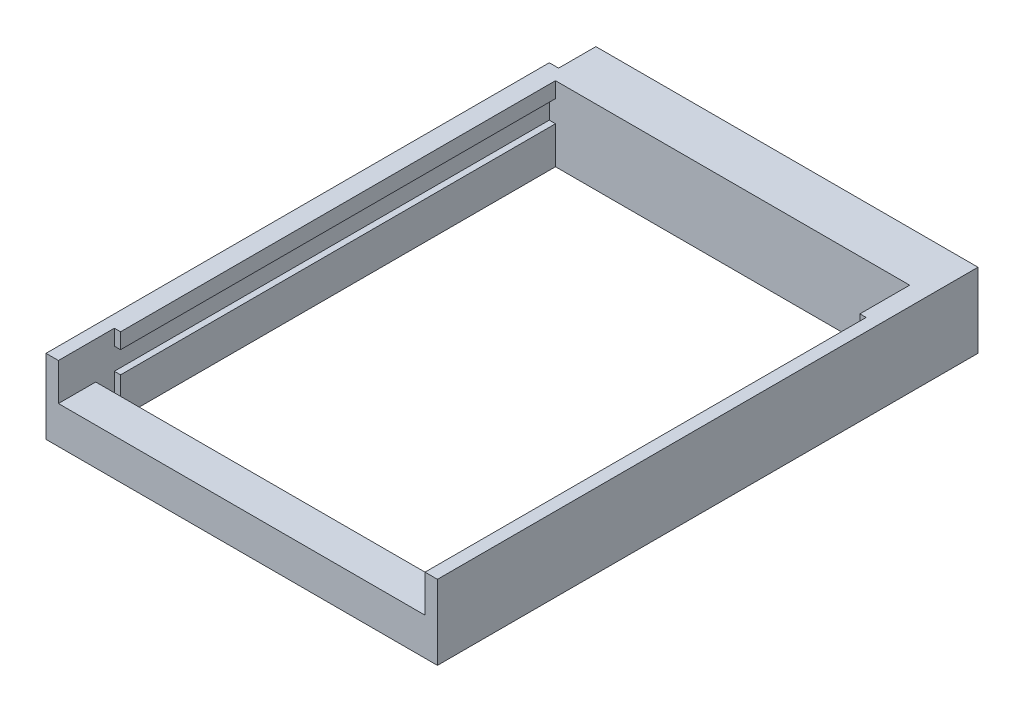
ISO-10303-21;
HEADER;
FILE_DESCRIPTION(('STEP AP214'),'2;1');
FILE_NAME('part.step','',(''),(''),'','','');
FILE_SCHEMA(('AUTOMOTIVE_DESIGN { 1 0 10303 214 1 1 1 1 }'));
ENDSEC;
DATA;
#1=APPLICATION_CONTEXT('core data for automotive mechanical design processes');
#2=APPLICATION_PROTOCOL_DEFINITION('international standard','automotive_design',2000,#1);
#3=PRODUCT_CONTEXT('',#1,'mechanical');
#4=PRODUCT('Part','Part','',(#3));
#5=PRODUCT_RELATED_PRODUCT_CATEGORY('part','',(#4));
#6=PRODUCT_DEFINITION_FORMATION('','',#4);
#7=PRODUCT_DEFINITION_CONTEXT('part definition',#1,'design');
#8=PRODUCT_DEFINITION('design','',#6,#7);
#9=PRODUCT_DEFINITION_SHAPE('','',#8);
#10=(LENGTH_UNIT() NAMED_UNIT(*) SI_UNIT(.MILLI.,.METRE.));
#11=(NAMED_UNIT(*) PLANE_ANGLE_UNIT() SI_UNIT($,.RADIAN.));
#12=(NAMED_UNIT(*) SI_UNIT($,.STERADIAN.) SOLID_ANGLE_UNIT());
#13=UNCERTAINTY_MEASURE_WITH_UNIT(LENGTH_MEASURE(1.E-05),#10,'distance_accuracy_value','');
#14=(GEOMETRIC_REPRESENTATION_CONTEXT(3) GLOBAL_UNCERTAINTY_ASSIGNED_CONTEXT((#13)) GLOBAL_UNIT_ASSIGNED_CONTEXT((#10,
#11,#12)) REPRESENTATION_CONTEXT('',''));
#15=CARTESIAN_POINT('',(0.,0.,0.));
#16=DIRECTION('',(0.,0.,1.));
#17=DIRECTION('',(1.,0.,0.));
#18=AXIS2_PLACEMENT_3D('',#15,#16,#17);
#19=CARTESIAN_POINT('',(14.75,-3.,0.));
#20=DIRECTION('',(-1.,0.,0.));
#21=DIRECTION('',(0.,0.,1.));
#22=AXIS2_PLACEMENT_3D('',#19,#20,#21);
#23=PLANE('',#22);
#24=DIRECTION('',(0.,-1.,0.));
#25=VECTOR('',#24,1.);
#26=CARTESIAN_POINT('',(14.75,-3.,16.75));
#27=LINE('',#26,#25);
#28=CARTESIAN_POINT('',(14.75,0.,16.75));
#29=VERTEX_POINT('',#28);
#30=CARTESIAN_POINT('',(14.75,-3.,16.75));
#31=VERTEX_POINT('',#30);
#32=EDGE_CURVE('E58',#29,#31,#27,.T.);
#33=ORIENTED_EDGE('',*,*,#32,.F.);
#34=DIRECTION('',(0.,0.,-1.));
#35=VECTOR('',#34,1.);
#36=CARTESIAN_POINT('',(14.75,0.,19.75));
#37=LINE('',#36,#35);
#38=CARTESIAN_POINT('',(14.75,0.,19.75));
#39=VERTEX_POINT('',#38);
#40=EDGE_CURVE('E61',#39,#29,#37,.T.);
#41=ORIENTED_EDGE('',*,*,#40,.F.);
#42=DIRECTION('',(0.,1.,0.));
#43=VECTOR('',#42,1.);
#44=CARTESIAN_POINT('',(14.75,-3.,19.75));
#45=LINE('',#44,#43);
#46=CARTESIAN_POINT('',(14.75,3.,19.75));
#47=VERTEX_POINT('',#46);
#48=EDGE_CURVE('E11',#39,#47,#45,.T.);
#49=ORIENTED_EDGE('',*,*,#48,.T.);
#50=DIRECTION('',(0.,0.,1.));
#51=VECTOR('',#50,1.);
#52=CARTESIAN_POINT('',(14.75,3.,0.));
#53=LINE('',#52,#51);
#54=CARTESIAN_POINT('',(14.75,3.,-15.75));
#55=VERTEX_POINT('',#54);
#56=EDGE_CURVE('E317',#55,#47,#53,.T.);
#57=ORIENTED_EDGE('',*,*,#56,.F.);
#58=DIRECTION('',(0.,1.,0.));
#59=VECTOR('',#58,1.);
#60=CARTESIAN_POINT('',(14.75,0.,-15.75));
#61=LINE('',#60,#59);
#62=CARTESIAN_POINT('',(14.75,1.75,-15.75));
#63=VERTEX_POINT('',#62);
#64=EDGE_CURVE('E859',#63,#55,#61,.T.);
#65=ORIENTED_EDGE('',*,*,#64,.F.);
#66=DIRECTION('',(0.,0.,-1.));
#67=VECTOR('',#66,1.);
#68=CARTESIAN_POINT('',(14.75,1.75,-15.75));
#69=LINE('',#68,#67);
#70=CARTESIAN_POINT('',(14.75,1.75,-19.75));
#71=VERTEX_POINT('',#70);
#72=EDGE_CURVE('E861',#63,#71,#69,.T.);
#73=ORIENTED_EDGE('',*,*,#72,.T.);
#74=DIRECTION('',(0.,1.,0.));
#75=VECTOR('',#74,1.);
#76=CARTESIAN_POINT('',(14.75,-3.,-19.75));
#77=LINE('',#76,#75);
#78=CARTESIAN_POINT('',(14.75,0.,-19.75));
#79=VERTEX_POINT('',#78);
#80=EDGE_CURVE('E50',#79,#71,#77,.T.);
#81=ORIENTED_EDGE('',*,*,#80,.F.);
#82=DIRECTION('',(0.,0.,-1.));
#83=VECTOR('',#82,1.);
#84=CARTESIAN_POINT('',(14.75,0.,15.25));
#85=LINE('',#84,#83);
#86=CARTESIAN_POINT('',(14.75,0.,15.25));
#87=VERTEX_POINT('',#86);
#88=EDGE_CURVE('E446',#87,#79,#85,.T.);
#89=ORIENTED_EDGE('',*,*,#88,.F.);
#90=DIRECTION('',(0.,1.,0.));
#91=VECTOR('',#90,1.);
#92=CARTESIAN_POINT('',(14.75,0.,15.25));
#93=LINE('',#92,#91);
#94=CARTESIAN_POINT('',(14.75,-3.,15.25));
#95=VERTEX_POINT('',#94);
#96=EDGE_CURVE('E443',#95,#87,#93,.T.);
#97=ORIENTED_EDGE('',*,*,#96,.F.);
#98=DIRECTION('',(0.,0.,1.));
#99=VECTOR('',#98,1.);
#100=CARTESIAN_POINT('',(14.75,-3.,0.));
#101=LINE('',#100,#99);
#102=EDGE_CURVE('E276',#95,#31,#101,.T.);
#103=ORIENTED_EDGE('',*,*,#102,.T.);
#104=EDGE_LOOP('',(#33,#41,#49,#57,#65,#73,#81,#89,#97,#103));
#105=FACE_BOUND('',#104,.T.);
#106=ADVANCED_FACE('F41',(#105),#23,.T.);
#107=CARTESIAN_POINT('',(-14.75,-3.,0.));
#108=DIRECTION('',(-1.,0.,0.));
#109=DIRECTION('',(0.,0.,1.));
#110=AXIS2_PLACEMENT_3D('',#107,#108,#109);
#111=PLANE('',#110);
#112=DIRECTION('',(0.,0.,1.));
#113=VECTOR('',#112,1.);
#114=CARTESIAN_POINT('',(-14.75,0.,19.75));
#115=LINE('',#114,#113);
#116=CARTESIAN_POINT('',(-14.75,0.,16.75));
#117=VERTEX_POINT('',#116);
#118=CARTESIAN_POINT('',(-14.75,0.,19.75));
#119=VERTEX_POINT('',#118);
#120=EDGE_CURVE('E266',#117,#119,#115,.T.);
#121=ORIENTED_EDGE('',*,*,#120,.F.);
#122=DIRECTION('',(0.,1.,0.));
#123=VECTOR('',#122,1.);
#124=CARTESIAN_POINT('',(-14.75,-3.,16.75));
#125=LINE('',#124,#123);
#126=CARTESIAN_POINT('',(-14.75,-3.,16.75));
#127=VERTEX_POINT('',#126);
#128=EDGE_CURVE('E253',#127,#117,#125,.T.);
#129=ORIENTED_EDGE('',*,*,#128,.F.);
#130=DIRECTION('',(0.,0.,1.));
#131=VECTOR('',#130,1.);
#132=CARTESIAN_POINT('',(-14.75,-3.,0.));
#133=LINE('',#132,#131);
#134=CARTESIAN_POINT('',(-14.75,-3.,15.25));
#135=VERTEX_POINT('',#134);
#136=EDGE_CURVE('E262',#135,#127,#133,.T.);
#137=ORIENTED_EDGE('',*,*,#136,.F.);
#138=DIRECTION('',(0.,-1.,0.));
#139=VECTOR('',#138,1.);
#140=CARTESIAN_POINT('',(-14.75,0.,15.25));
#141=LINE('',#140,#139);
#142=CARTESIAN_POINT('',(-14.75,0.,15.25));
#143=VERTEX_POINT('',#142);
#144=EDGE_CURVE('E486',#143,#135,#141,.T.);
#145=ORIENTED_EDGE('',*,*,#144,.F.);
#146=DIRECTION('',(0.,0.,-1.));
#147=VECTOR('',#146,1.);
#148=CARTESIAN_POINT('',(-14.75,0.,15.25));
#149=LINE('',#148,#147);
#150=CARTESIAN_POINT('',(-14.75,0.,-19.75));
#151=VERTEX_POINT('',#150);
#152=EDGE_CURVE('E318',#143,#151,#149,.T.);
#153=ORIENTED_EDGE('',*,*,#152,.T.);
#154=DIRECTION('',(0.,1.,0.));
#155=VECTOR('',#154,1.);
#156=CARTESIAN_POINT('',(-14.75,-3.,-19.75));
#157=LINE('',#156,#155);
#158=CARTESIAN_POINT('',(-14.75,1.75,-19.75));
#159=VERTEX_POINT('',#158);
#160=EDGE_CURVE('E286',#151,#159,#157,.T.);
#161=ORIENTED_EDGE('',*,*,#160,.T.);
#162=DIRECTION('',(0.,0.,-1.));
#163=VECTOR('',#162,1.);
#164=CARTESIAN_POINT('',(-14.75,1.75,15.25));
#165=LINE('',#164,#163);
#166=CARTESIAN_POINT('',(-14.75,1.75,15.25));
#167=VERTEX_POINT('',#166);
#168=EDGE_CURVE('E480',#167,#159,#165,.T.);
#169=ORIENTED_EDGE('',*,*,#168,.F.);
#170=DIRECTION('',(0.,-1.,0.));
#171=VECTOR('',#170,1.);
#172=CARTESIAN_POINT('',(-14.75,0.,15.25));
#173=LINE('',#172,#171);
#174=CARTESIAN_POINT('',(-14.75,3.,15.25));
#175=VERTEX_POINT('',#174);
#176=EDGE_CURVE('E460',#175,#167,#173,.T.);
#177=ORIENTED_EDGE('',*,*,#176,.F.);
#178=DIRECTION('',(0.,0.,1.));
#179=VECTOR('',#178,1.);
#180=CARTESIAN_POINT('',(-14.75,3.,0.));
#181=LINE('',#180,#179);
#182=CARTESIAN_POINT('',(-14.75,3.,19.75));
#183=VERTEX_POINT('',#182);
#184=EDGE_CURVE('E324',#175,#183,#181,.T.);
#185=ORIENTED_EDGE('',*,*,#184,.T.);
#186=DIRECTION('',(0.,1.,0.));
#187=VECTOR('',#186,1.);
#188=CARTESIAN_POINT('',(-14.75,-3.,19.75));
#189=LINE('',#188,#187);
#190=EDGE_CURVE('E289',#119,#183,#189,.T.);
#191=ORIENTED_EDGE('',*,*,#190,.F.);
#192=EDGE_LOOP('',(#121,#129,#137,#145,#153,#161,#169,#177,#185,#191));
#193=FACE_BOUND('',#192,.T.);
#194=ADVANCED_FACE('F261',(#193),#111,.F.);
#195=CARTESIAN_POINT('',(0.,-3.,-19.75));
#196=DIRECTION('',(0.,0.,1.));
#197=DIRECTION('',(1.,0.,0.));
#198=AXIS2_PLACEMENT_3D('',#195,#196,#197);
#199=PLANE('',#198);
#200=DIRECTION('',(-1.,0.,0.));
#201=VECTOR('',#200,1.);
#202=CARTESIAN_POINT('',(0.,1.75,-19.75));
#203=LINE('',#202,#201);
#204=CARTESIAN_POINT('',(14.25,1.75,-19.75));
#205=VERTEX_POINT('',#204);
#206=EDGE_CURVE('E854',#71,#205,#203,.T.);
#207=ORIENTED_EDGE('',*,*,#206,.T.);
#208=DIRECTION('',(0.,-1.,0.));
#209=VECTOR('',#208,1.);
#210=CARTESIAN_POINT('',(14.25,0.,-19.75));
#211=LINE('',#210,#209);
#212=CARTESIAN_POINT('',(14.25,3.,-19.75));
#213=VERTEX_POINT('',#212);
#214=EDGE_CURVE('E849',#213,#205,#211,.T.);
#215=ORIENTED_EDGE('',*,*,#214,.F.);
#216=DIRECTION('',(1.,0.,0.));
#217=VECTOR('',#216,1.);
#218=CARTESIAN_POINT('',(0.,3.,-19.75));
#219=LINE('',#218,#217);
#220=CARTESIAN_POINT('',(-14.25,3.,-19.75));
#221=VERTEX_POINT('',#220);
#222=EDGE_CURVE('E330',#221,#213,#219,.T.);
#223=ORIENTED_EDGE('',*,*,#222,.F.);
#224=DIRECTION('',(0.,-1.,0.));
#225=VECTOR('',#224,1.);
#226=CARTESIAN_POINT('',(-14.25,0.,-19.75));
#227=LINE('',#226,#225);
#228=CARTESIAN_POINT('',(-14.25,1.75,-19.75));
#229=VERTEX_POINT('',#228);
#230=EDGE_CURVE('E464',#221,#229,#227,.T.);
#231=ORIENTED_EDGE('',*,*,#230,.T.);
#232=DIRECTION('',(1.,0.,0.));
#233=VECTOR('',#232,1.);
#234=CARTESIAN_POINT('',(0.,1.75000000000001,-19.75));
#235=LINE('',#234,#233);
#236=EDGE_CURVE('E459',#159,#229,#235,.T.);
#237=ORIENTED_EDGE('',*,*,#236,.F.);
#238=ORIENTED_EDGE('',*,*,#160,.F.);
#239=DIRECTION('',(1.,0.,0.));
#240=VECTOR('',#239,1.);
#241=CARTESIAN_POINT('',(0.,0.,-19.75));
#242=LINE('',#241,#240);
#243=CARTESIAN_POINT('',(-14.25,0.,-19.75));
#244=VERTEX_POINT('',#243);
#245=EDGE_CURVE('E482',#151,#244,#242,.T.);
#246=ORIENTED_EDGE('',*,*,#245,.T.);
#247=DIRECTION('',(0.,-1.,0.));
#248=VECTOR('',#247,1.);
#249=CARTESIAN_POINT('',(-14.25,0.,-19.75));
#250=LINE('',#249,#248);
#251=CARTESIAN_POINT('',(-14.25,-3.,-19.75));
#252=VERTEX_POINT('',#251);
#253=EDGE_CURVE('E487',#244,#252,#250,.T.);
#254=ORIENTED_EDGE('',*,*,#253,.T.);
#255=DIRECTION('',(1.,0.,0.));
#256=VECTOR('',#255,1.);
#257=CARTESIAN_POINT('',(0.,-3.,-19.75));
#258=LINE('',#257,#256);
#259=CARTESIAN_POINT('',(14.25,-3.,-19.75));
#260=VERTEX_POINT('',#259);
#261=EDGE_CURVE('E273',#252,#260,#258,.T.);
#262=ORIENTED_EDGE('',*,*,#261,.T.);
#263=DIRECTION('',(0.,-1.,0.));
#264=VECTOR('',#263,1.);
#265=CARTESIAN_POINT('',(14.25,0.,-19.75));
#266=LINE('',#265,#264);
#267=CARTESIAN_POINT('',(14.25,0.,-19.75));
#268=VERTEX_POINT('',#267);
#269=EDGE_CURVE('E438',#268,#260,#266,.T.);
#270=ORIENTED_EDGE('',*,*,#269,.F.);
#271=DIRECTION('',(-1.,0.,0.));
#272=VECTOR('',#271,1.);
#273=CARTESIAN_POINT('',(0.,0.,-19.75));
#274=LINE('',#273,#272);
#275=EDGE_CURVE('E402',#79,#268,#274,.T.);
#276=ORIENTED_EDGE('',*,*,#275,.F.);
#277=ORIENTED_EDGE('',*,*,#80,.T.);
#278=EDGE_LOOP('',(#207,#215,#223,#231,#237,#238,#246,#254,#262,#270,#276,#277));
#279=FACE_BOUND('',#278,.T.);
#280=ADVANCED_FACE('F508',(#279),#199,.T.);
#281=CARTESIAN_POINT('',(0.,-3.,19.75));
#282=DIRECTION('',(0.,0.,1.));
#283=DIRECTION('',(1.,0.,0.));
#284=AXIS2_PLACEMENT_3D('',#281,#282,#283);
#285=PLANE('',#284);
#286=DIRECTION('',(0.,1.,0.));
#287=VECTOR('',#286,1.);
#288=CARTESIAN_POINT('',(-15.75,-3.,19.75));
#289=LINE('',#288,#287);
#290=CARTESIAN_POINT('',(-15.75,-3.,19.75));
#291=VERTEX_POINT('',#290);
#292=CARTESIAN_POINT('',(-15.75,3.,19.75));
#293=VERTEX_POINT('',#292);
#294=EDGE_CURVE('E291',#291,#293,#289,.T.);
#295=ORIENTED_EDGE('',*,*,#294,.F.);
#296=DIRECTION('',(1.,0.,0.));
#297=VECTOR('',#296,1.);
#298=CARTESIAN_POINT('',(0.,-3.,19.75));
#299=LINE('',#298,#297);
#300=CARTESIAN_POINT('',(15.75,-3.,19.75));
#301=VERTEX_POINT('',#300);
#302=EDGE_CURVE('E306',#291,#301,#299,.T.);
#303=ORIENTED_EDGE('',*,*,#302,.T.);
#304=DIRECTION('',(0.,1.,0.));
#305=VECTOR('',#304,1.);
#306=CARTESIAN_POINT('',(15.75,-3.,19.75));
#307=LINE('',#306,#305);
#308=CARTESIAN_POINT('',(15.75,3.,19.75));
#309=VERTEX_POINT('',#308);
#310=EDGE_CURVE('E45',#301,#309,#307,.T.);
#311=ORIENTED_EDGE('',*,*,#310,.T.);
#312=DIRECTION('',(1.,0.,0.));
#313=VECTOR('',#312,1.);
#314=CARTESIAN_POINT('',(0.,3.,19.75));
#315=LINE('',#314,#313);
#316=EDGE_CURVE('E305',#47,#309,#315,.T.);
#317=ORIENTED_EDGE('',*,*,#316,.F.);
#318=ORIENTED_EDGE('',*,*,#48,.F.);
#319=DIRECTION('',(-1.,0.,0.));
#320=VECTOR('',#319,1.);
#321=CARTESIAN_POINT('',(15.752,0.,19.75));
#322=LINE('',#321,#320);
#323=EDGE_CURVE('E267',#39,#119,#322,.T.);
#324=ORIENTED_EDGE('',*,*,#323,.T.);
#325=ORIENTED_EDGE('',*,*,#190,.T.);
#326=EDGE_CURVE('E320',#293,#183,#315,.T.);
#327=ORIENTED_EDGE('',*,*,#326,.F.);
#328=EDGE_LOOP('',(#295,#303,#311,#317,#318,#324,#325,#327));
#329=FACE_BOUND('',#328,.T.);
#330=ADVANCED_FACE('F303',(#329),#285,.T.);
#331=CARTESIAN_POINT('',(-15.75,-3.,0.));
#332=DIRECTION('',(1.,0.,0.));
#333=DIRECTION('',(0.,0.,-1.));
#334=AXIS2_PLACEMENT_3D('',#331,#332,#333);
#335=PLANE('',#334);
#336=DIRECTION('',(0.,0.,-1.));
#337=VECTOR('',#336,1.);
#338=CARTESIAN_POINT('',(-15.75,3.,0.));
#339=LINE('',#338,#337);
#340=CARTESIAN_POINT('',(-15.75,3.,-20.75));
#341=VERTEX_POINT('',#340);
#342=EDGE_CURVE('E325',#293,#341,#339,.T.);
#343=ORIENTED_EDGE('',*,*,#342,.T.);
#344=DIRECTION('',(0.,1.,0.));
#345=VECTOR('',#344,1.);
#346=CARTESIAN_POINT('',(-15.75,-3.001,-20.75));
#347=LINE('',#346,#345);
#348=CARTESIAN_POINT('',(-15.75,-3.,-20.75));
#349=VERTEX_POINT('',#348);
#350=EDGE_CURVE('E367',#349,#341,#347,.T.);
#351=ORIENTED_EDGE('',*,*,#350,.F.);
#352=DIRECTION('',(0.,0.,-1.));
#353=VECTOR('',#352,1.);
#354=CARTESIAN_POINT('',(-15.75,-3.,0.));
#355=LINE('',#354,#353);
#356=EDGE_CURVE('E274',#291,#349,#355,.T.);
#357=ORIENTED_EDGE('',*,*,#356,.F.);
#358=ORIENTED_EDGE('',*,*,#294,.T.);
#359=EDGE_LOOP('',(#343,#351,#357,#358));
#360=FACE_BOUND('',#359,.T.);
#361=ADVANCED_FACE('F556',(#360),#335,.F.);
#362=CARTESIAN_POINT('',(0.,-3.,-23.75));
#363=DIRECTION('',(0.,0.,1.));
#364=DIRECTION('',(1.,0.,0.));
#365=AXIS2_PLACEMENT_3D('',#362,#363,#364);
#366=PLANE('',#365);
#367=DIRECTION('',(1.,0.,0.));
#368=VECTOR('',#367,1.);
#369=CARTESIAN_POINT('',(0.,-3.,-23.75));
#370=LINE('',#369,#368);
#371=CARTESIAN_POINT('',(-15.,-3.,-23.75));
#372=VERTEX_POINT('',#371);
#373=CARTESIAN_POINT('',(-12.25,-3.,-23.75));
#374=VERTEX_POINT('',#373);
#375=EDGE_CURVE('E279',#372,#374,#370,.T.);
#376=ORIENTED_EDGE('',*,*,#375,.F.);
#377=DIRECTION('',(0.,1.,0.));
#378=VECTOR('',#377,1.);
#379=CARTESIAN_POINT('',(-15.,-3.001,-23.75));
#380=LINE('',#379,#378);
#381=CARTESIAN_POINT('',(-15.,3.,-23.75));
#382=VERTEX_POINT('',#381);
#383=EDGE_CURVE('E360',#372,#382,#380,.T.);
#384=ORIENTED_EDGE('',*,*,#383,.T.);
#385=DIRECTION('',(1.,0.,0.));
#386=VECTOR('',#385,1.);
#387=CARTESIAN_POINT('',(0.,3.,-23.75));
#388=LINE('',#387,#386);
#389=CARTESIAN_POINT('',(15.75,3.,-23.75));
#390=VERTEX_POINT('',#389);
#391=EDGE_CURVE('E311',#382,#390,#388,.T.);
#392=ORIENTED_EDGE('',*,*,#391,.T.);
#393=DIRECTION('',(0.,1.,0.));
#394=VECTOR('',#393,1.);
#395=CARTESIAN_POINT('',(15.75,-3.,-23.75));
#396=LINE('',#395,#394);
#397=CARTESIAN_POINT('',(15.75,-3.,-23.75));
#398=VERTEX_POINT('',#397);
#399=EDGE_CURVE('E292',#398,#390,#396,.T.);
#400=ORIENTED_EDGE('',*,*,#399,.F.);
#401=CARTESIAN_POINT('',(12.25,-3.,-23.75));
#402=VERTEX_POINT('',#401);
#403=EDGE_CURVE('E343',#402,#398,#370,.T.);
#404=ORIENTED_EDGE('',*,*,#403,.F.);
#405=DIRECTION('',(0.,-1.,0.));
#406=VECTOR('',#405,1.);
#407=CARTESIAN_POINT('',(12.25,-3.,-23.75));
#408=LINE('',#407,#406);
#409=CARTESIAN_POINT('',(12.25,0.,-23.75));
#410=VERTEX_POINT('',#409);
#411=EDGE_CURVE('E392',#410,#402,#408,.T.);
#412=ORIENTED_EDGE('',*,*,#411,.F.);
#413=DIRECTION('',(1.,0.,0.));
#414=VECTOR('',#413,1.);
#415=CARTESIAN_POINT('',(12.25,0.,-23.75));
#416=LINE('',#415,#414);
#417=CARTESIAN_POINT('',(6.25000000000001,0.,-23.75));
#418=VERTEX_POINT('',#417);
#419=EDGE_CURVE('E383',#418,#410,#416,.T.);
#420=ORIENTED_EDGE('',*,*,#419,.F.);
#421=DIRECTION('',(0.,1.,0.));
#422=VECTOR('',#421,1.);
#423=CARTESIAN_POINT('',(6.25000000000001,-3.,-23.75));
#424=LINE('',#423,#422);
#425=CARTESIAN_POINT('',(6.25000000000001,-3.,-23.75));
#426=VERTEX_POINT('',#425);
#427=EDGE_CURVE('E394',#426,#418,#424,.T.);
#428=ORIENTED_EDGE('',*,*,#427,.F.);
#429=CARTESIAN_POINT('',(-6.25000000000001,-3.,-23.75));
#430=VERTEX_POINT('',#429);
#431=EDGE_CURVE('E344',#430,#426,#370,.T.);
#432=ORIENTED_EDGE('',*,*,#431,.F.);
#433=DIRECTION('',(0.,-1.,0.));
#434=VECTOR('',#433,1.);
#435=CARTESIAN_POINT('',(-6.25000000000001,-3.,-23.75));
#436=LINE('',#435,#434);
#437=CARTESIAN_POINT('',(-6.25000000000001,0.,-23.75));
#438=VERTEX_POINT('',#437);
#439=EDGE_CURVE('E417',#438,#430,#436,.T.);
#440=ORIENTED_EDGE('',*,*,#439,.F.);
#441=DIRECTION('',(1.,0.,0.));
#442=VECTOR('',#441,1.);
#443=CARTESIAN_POINT('',(-12.25,0.,-23.75));
#444=LINE('',#443,#442);
#445=CARTESIAN_POINT('',(-12.25,0.,-23.75));
#446=VERTEX_POINT('',#445);
#447=EDGE_CURVE('E419',#446,#438,#444,.T.);
#448=ORIENTED_EDGE('',*,*,#447,.F.);
#449=DIRECTION('',(0.,1.,0.));
#450=VECTOR('',#449,1.);
#451=CARTESIAN_POINT('',(-12.25,-3.,-23.75));
#452=LINE('',#451,#450);
#453=EDGE_CURVE('E395',#374,#446,#452,.T.);
#454=ORIENTED_EDGE('',*,*,#453,.F.);
#455=EDGE_LOOP('',(#376,#384,#392,#400,#404,#412,#420,#428,#432,#440,#448,#454));
#456=FACE_BOUND('',#455,.T.);
#457=ADVANCED_FACE('F358',(#456),#366,.F.);
#458=CARTESIAN_POINT('',(15.75,-3.,0.));
#459=DIRECTION('',(1.,0.,0.));
#460=DIRECTION('',(0.,0.,-1.));
#461=AXIS2_PLACEMENT_3D('',#458,#459,#460);
#462=PLANE('',#461);
#463=ORIENTED_EDGE('',*,*,#399,.T.);
#464=DIRECTION('',(0.,0.,-1.));
#465=VECTOR('',#464,1.);
#466=CARTESIAN_POINT('',(15.75,3.,0.));
#467=LINE('',#466,#465);
#468=EDGE_CURVE('E308',#309,#390,#467,.T.);
#469=ORIENTED_EDGE('',*,*,#468,.F.);
#470=ORIENTED_EDGE('',*,*,#310,.F.);
#471=DIRECTION('',(0.,0.,-1.));
#472=VECTOR('',#471,1.);
#473=CARTESIAN_POINT('',(15.75,-3.,0.));
#474=LINE('',#473,#472);
#475=EDGE_CURVE('E342',#301,#398,#474,.T.);
#476=ORIENTED_EDGE('',*,*,#475,.T.);
#477=EDGE_LOOP('',(#463,#469,#470,#476));
#478=FACE_BOUND('',#477,.T.);
#479=ADVANCED_FACE('F43',(#478),#462,.T.);
#480=CARTESIAN_POINT('',(0.,-3.,0.));
#481=DIRECTION('',(0.,1.,0.));
#482=DIRECTION('',(0.,0.,1.));
#483=AXIS2_PLACEMENT_3D('',#480,#481,#482);
#484=PLANE('',#483);
#485=ORIENTED_EDGE('',*,*,#302,.F.);
#486=ORIENTED_EDGE('',*,*,#356,.T.);
#487=DIRECTION('',(-1.,0.,0.));
#488=VECTOR('',#487,1.);
#489=CARTESIAN_POINT('',(-15.75,-3.,-20.75));
#490=LINE('',#489,#488);
#491=CARTESIAN_POINT('',(-15.,-3.,-20.75));
#492=VERTEX_POINT('',#491);
#493=EDGE_CURVE('E376',#492,#349,#490,.T.);
#494=ORIENTED_EDGE('',*,*,#493,.F.);
#495=DIRECTION('',(0.,0.,1.));
#496=VECTOR('',#495,1.);
#497=CARTESIAN_POINT('',(-15.,-3.,-23.75));
#498=LINE('',#497,#496);
#499=EDGE_CURVE('E371',#372,#492,#498,.T.);
#500=ORIENTED_EDGE('',*,*,#499,.F.);
#501=ORIENTED_EDGE('',*,*,#375,.T.);
#502=DIRECTION('',(0.,0.,-1.));
#503=VECTOR('',#502,1.);
#504=CARTESIAN_POINT('',(-12.25,-3.,-22.25));
#505=LINE('',#504,#503);
#506=CARTESIAN_POINT('',(-12.25,-3.,-22.25));
#507=VERTEX_POINT('',#506);
#508=EDGE_CURVE('E379',#507,#374,#505,.T.);
#509=ORIENTED_EDGE('',*,*,#508,.F.);
#510=DIRECTION('',(-1.,0.,0.));
#511=VECTOR('',#510,1.);
#512=CARTESIAN_POINT('',(-12.25,-3.,-22.25));
#513=LINE('',#512,#511);
#514=CARTESIAN_POINT('',(-6.25000000000001,-3.,-22.25));
#515=VERTEX_POINT('',#514);
#516=EDGE_CURVE('E410',#515,#507,#513,.T.);
#517=ORIENTED_EDGE('',*,*,#516,.F.);
#518=DIRECTION('',(0.,0.,-1.));
#519=VECTOR('',#518,1.);
#520=CARTESIAN_POINT('',(-6.25000000000001,-3.,-22.25));
#521=LINE('',#520,#519);
#522=EDGE_CURVE('E413',#515,#430,#521,.T.);
#523=ORIENTED_EDGE('',*,*,#522,.T.);
#524=ORIENTED_EDGE('',*,*,#431,.T.);
#525=DIRECTION('',(0.,0.,-1.));
#526=VECTOR('',#525,1.);
#527=CARTESIAN_POINT('',(6.25000000000001,-3.,-22.25));
#528=LINE('',#527,#526);
#529=CARTESIAN_POINT('',(6.25000000000001,-3.,-22.25));
#530=VERTEX_POINT('',#529);
#531=EDGE_CURVE('E405',#530,#426,#528,.T.);
#532=ORIENTED_EDGE('',*,*,#531,.F.);
#533=DIRECTION('',(-1.,0.,0.));
#534=VECTOR('',#533,1.);
#535=CARTESIAN_POINT('',(12.25,-3.,-22.25));
#536=LINE('',#535,#534);
#537=CARTESIAN_POINT('',(12.25,-3.,-22.25));
#538=VERTEX_POINT('',#537);
#539=EDGE_CURVE('E382',#538,#530,#536,.T.);
#540=ORIENTED_EDGE('',*,*,#539,.F.);
#541=DIRECTION('',(0.,0.,-1.));
#542=VECTOR('',#541,1.);
#543=CARTESIAN_POINT('',(12.25,-3.,-22.25));
#544=LINE('',#543,#542);
#545=EDGE_CURVE('E355',#538,#402,#544,.T.);
#546=ORIENTED_EDGE('',*,*,#545,.T.);
#547=ORIENTED_EDGE('',*,*,#403,.T.);
#548=ORIENTED_EDGE('',*,*,#475,.F.);
#549=EDGE_LOOP('',(#485,#486,#494,#500,#501,#509,#517,#523,#524,#532,#540,#546,#547,#548));
#550=FACE_BOUND('',#549,.T.);
#551=DIRECTION('',(-1.,0.,0.));
#552=VECTOR('',#551,1.);
#553=CARTESIAN_POINT('',(15.752,-3.,16.75));
#554=LINE('',#553,#552);
#555=EDGE_CURVE('E249',#31,#127,#554,.T.);
#556=ORIENTED_EDGE('',*,*,#555,.F.);
#557=ORIENTED_EDGE('',*,*,#102,.F.);
#558=DIRECTION('',(1.,0.,0.));
#559=VECTOR('',#558,1.);
#560=CARTESIAN_POINT('',(0.,-3.,15.25));
#561=LINE('',#560,#559);
#562=CARTESIAN_POINT('',(14.25,-3.,15.25));
#563=VERTEX_POINT('',#562);
#564=EDGE_CURVE('E440',#563,#95,#561,.T.);
#565=ORIENTED_EDGE('',*,*,#564,.F.);
#566=DIRECTION('',(0.,0.,-1.));
#567=VECTOR('',#566,1.);
#568=CARTESIAN_POINT('',(14.25,-3.,15.25));
#569=LINE('',#568,#567);
#570=EDGE_CURVE('E453',#563,#260,#569,.T.);
#571=ORIENTED_EDGE('',*,*,#570,.T.);
#572=ORIENTED_EDGE('',*,*,#261,.F.);
#573=DIRECTION('',(0.,0.,-1.));
#574=VECTOR('',#573,1.);
#575=CARTESIAN_POINT('',(-14.25,-3.,15.25));
#576=LINE('',#575,#574);
#577=CARTESIAN_POINT('',(-14.25,-3.,15.25));
#578=VERTEX_POINT('',#577);
#579=EDGE_CURVE('E321',#578,#252,#576,.T.);
#580=ORIENTED_EDGE('',*,*,#579,.F.);
#581=DIRECTION('',(1.,0.,0.));
#582=VECTOR('',#581,1.);
#583=CARTESIAN_POINT('',(0.,-3.,15.25));
#584=LINE('',#583,#582);
#585=EDGE_CURVE('E272',#135,#578,#584,.T.);
#586=ORIENTED_EDGE('',*,*,#585,.F.);
#587=ORIENTED_EDGE('',*,*,#136,.T.);
#588=EDGE_LOOP('',(#556,#557,#565,#571,#572,#580,#586,#587));
#589=FACE_BOUND('',#588,.T.);
#590=ADVANCED_FACE('F270',(#550,#589),#484,.F.);
#591=CARTESIAN_POINT('',(0.,3.,0.));
#592=DIRECTION('',(0.,1.,0.));
#593=DIRECTION('',(0.,0.,1.));
#594=AXIS2_PLACEMENT_3D('',#591,#592,#593);
#595=PLANE('',#594);
#596=DIRECTION('',(-1.,0.,0.));
#597=VECTOR('',#596,1.);
#598=CARTESIAN_POINT('',(0.,3.,-15.75));
#599=LINE('',#598,#597);
#600=CARTESIAN_POINT('',(14.25,3.,-15.75));
#601=VERTEX_POINT('',#600);
#602=EDGE_CURVE('E850',#55,#601,#599,.T.);
#603=ORIENTED_EDGE('',*,*,#602,.F.);
#604=ORIENTED_EDGE('',*,*,#56,.T.);
#605=ORIENTED_EDGE('',*,*,#316,.T.);
#606=ORIENTED_EDGE('',*,*,#468,.T.);
#607=ORIENTED_EDGE('',*,*,#391,.F.);
#608=DIRECTION('',(0.,0.,-1.));
#609=VECTOR('',#608,1.);
#610=CARTESIAN_POINT('',(-15.,3.,-23.75));
#611=LINE('',#610,#609);
#612=CARTESIAN_POINT('',(-15.,3.,-20.75));
#613=VERTEX_POINT('',#612);
#614=EDGE_CURVE('E363',#613,#382,#611,.T.);
#615=ORIENTED_EDGE('',*,*,#614,.F.);
#616=DIRECTION('',(1.,0.,0.));
#617=VECTOR('',#616,1.);
#618=CARTESIAN_POINT('',(-15.75,3.,-20.75));
#619=LINE('',#618,#617);
#620=EDGE_CURVE('E365',#341,#613,#619,.T.);
#621=ORIENTED_EDGE('',*,*,#620,.F.);
#622=ORIENTED_EDGE('',*,*,#342,.F.);
#623=ORIENTED_EDGE('',*,*,#326,.T.);
#624=ORIENTED_EDGE('',*,*,#184,.F.);
#625=DIRECTION('',(-1.,0.,0.));
#626=VECTOR('',#625,1.);
#627=CARTESIAN_POINT('',(0.,3.,15.25));
#628=LINE('',#627,#626);
#629=CARTESIAN_POINT('',(-14.25,3.,15.25));
#630=VERTEX_POINT('',#629);
#631=EDGE_CURVE('E469',#630,#175,#628,.T.);
#632=ORIENTED_EDGE('',*,*,#631,.F.);
#633=DIRECTION('',(0.,0.,-1.));
#634=VECTOR('',#633,1.);
#635=CARTESIAN_POINT('',(-14.25,3.,15.25));
#636=LINE('',#635,#634);
#637=EDGE_CURVE('E471',#630,#221,#636,.T.);
#638=ORIENTED_EDGE('',*,*,#637,.T.);
#639=ORIENTED_EDGE('',*,*,#222,.T.);
#640=DIRECTION('',(0.,0.,-1.));
#641=VECTOR('',#640,1.);
#642=CARTESIAN_POINT('',(14.25,3.,-15.75));
#643=LINE('',#642,#641);
#644=EDGE_CURVE('E869',#601,#213,#643,.T.);
#645=ORIENTED_EDGE('',*,*,#644,.F.);
#646=EDGE_LOOP('',(#603,#604,#605,#606,#607,#615,#621,#622,#623,#624,#632,#638,#639,#645));
#647=FACE_BOUND('',#646,.T.);
#648=ADVANCED_FACE('F315',(#647),#595,.T.);
#649=CARTESIAN_POINT('',(0.,0.,15.25));
#650=DIRECTION('',(0.,1.,0.));
#651=DIRECTION('',(-1.,0.,0.));
#652=AXIS2_PLACEMENT_3D('',#649,#650,#651);
#653=PLANE('',#652);
#654=ORIENTED_EDGE('',*,*,#245,.F.);
#655=ORIENTED_EDGE('',*,*,#152,.F.);
#656=DIRECTION('',(1.,0.,0.));
#657=VECTOR('',#656,1.);
#658=CARTESIAN_POINT('',(0.,0.,15.25));
#659=LINE('',#658,#657);
#660=CARTESIAN_POINT('',(-14.25,0.,15.25));
#661=VERTEX_POINT('',#660);
#662=EDGE_CURVE('E483',#143,#661,#659,.T.);
#663=ORIENTED_EDGE('',*,*,#662,.T.);
#664=DIRECTION('',(0.,0.,-1.));
#665=VECTOR('',#664,1.);
#666=CARTESIAN_POINT('',(-14.25,0.,15.25));
#667=LINE('',#666,#665);
#668=EDGE_CURVE('E493',#661,#244,#667,.T.);
#669=ORIENTED_EDGE('',*,*,#668,.T.);
#670=EDGE_LOOP('',(#654,#655,#663,#669));
#671=FACE_BOUND('',#670,.T.);
#672=ADVANCED_FACE('F514',(#671),#653,.T.);
#673=CARTESIAN_POINT('',(-14.25,0.,15.25));
#674=DIRECTION('',(1.,0.,0.));
#675=DIRECTION('',(0.,1.,0.));
#676=AXIS2_PLACEMENT_3D('',#673,#674,#675);
#677=PLANE('',#676);
#678=ORIENTED_EDGE('',*,*,#253,.F.);
#679=ORIENTED_EDGE('',*,*,#668,.F.);
#680=DIRECTION('',(0.,-1.,0.));
#681=VECTOR('',#680,1.);
#682=CARTESIAN_POINT('',(-14.25,0.,15.25));
#683=LINE('',#682,#681);
#684=EDGE_CURVE('E490',#661,#578,#683,.T.);
#685=ORIENTED_EDGE('',*,*,#684,.T.);
#686=ORIENTED_EDGE('',*,*,#579,.T.);
#687=EDGE_LOOP('',(#678,#679,#685,#686));
#688=FACE_BOUND('',#687,.T.);
#689=ADVANCED_FACE('F502',(#688),#677,.T.);
#690=CARTESIAN_POINT('',(0.,0.,15.25));
#691=DIRECTION('',(0.,0.,1.));
#692=DIRECTION('',(1.,0.,0.));
#693=AXIS2_PLACEMENT_3D('',#690,#691,#692);
#694=PLANE('',#693);
#695=ORIENTED_EDGE('',*,*,#662,.F.);
#696=ORIENTED_EDGE('',*,*,#144,.T.);
#697=ORIENTED_EDGE('',*,*,#585,.T.);
#698=ORIENTED_EDGE('',*,*,#684,.F.);
#699=EDGE_LOOP('',(#695,#696,#697,#698));
#700=FACE_BOUND('',#699,.T.);
#701=ADVANCED_FACE('F517',(#700),#694,.T.);
#702=CARTESIAN_POINT('',(0.,1.75000000000001,15.25));
#703=DIRECTION('',(0.,1.,0.));
#704=DIRECTION('',(-1.,0.,0.));
#705=AXIS2_PLACEMENT_3D('',#702,#703,#704);
#706=PLANE('',#705);
#707=ORIENTED_EDGE('',*,*,#236,.T.);
#708=DIRECTION('',(0.,0.,-1.));
#709=VECTOR('',#708,1.);
#710=CARTESIAN_POINT('',(-14.25,1.75,15.25));
#711=LINE('',#710,#709);
#712=CARTESIAN_POINT('',(-14.25,1.75,15.25));
#713=VERTEX_POINT('',#712);
#714=EDGE_CURVE('E478',#713,#229,#711,.T.);
#715=ORIENTED_EDGE('',*,*,#714,.F.);
#716=DIRECTION('',(1.,0.,0.));
#717=VECTOR('',#716,1.);
#718=CARTESIAN_POINT('',(0.,1.75000000000001,15.25));
#719=LINE('',#718,#717);
#720=EDGE_CURVE('E463',#167,#713,#719,.T.);
#721=ORIENTED_EDGE('',*,*,#720,.F.);
#722=ORIENTED_EDGE('',*,*,#168,.T.);
#723=EDGE_LOOP('',(#707,#715,#721,#722));
#724=FACE_BOUND('',#723,.T.);
#725=ADVANCED_FACE('F521',(#724),#706,.F.);
#726=CARTESIAN_POINT('',(-14.25,0.,15.25));
#727=DIRECTION('',(1.,0.,0.));
#728=DIRECTION('',(0.,1.,0.));
#729=AXIS2_PLACEMENT_3D('',#726,#727,#728);
#730=PLANE('',#729);
#731=ORIENTED_EDGE('',*,*,#230,.F.);
#732=ORIENTED_EDGE('',*,*,#637,.F.);
#733=DIRECTION('',(0.,-1.,0.));
#734=VECTOR('',#733,1.);
#735=CARTESIAN_POINT('',(-14.25,0.,15.25));
#736=LINE('',#735,#734);
#737=EDGE_CURVE('E466',#630,#713,#736,.T.);
#738=ORIENTED_EDGE('',*,*,#737,.T.);
#739=ORIENTED_EDGE('',*,*,#714,.T.);
#740=EDGE_LOOP('',(#731,#732,#738,#739));
#741=FACE_BOUND('',#740,.T.);
#742=ADVANCED_FACE('F526',(#741),#730,.T.);
#743=CARTESIAN_POINT('',(0.,0.,15.25));
#744=DIRECTION('',(0.,0.,1.));
#745=DIRECTION('',(1.,0.,0.));
#746=AXIS2_PLACEMENT_3D('',#743,#744,#745);
#747=PLANE('',#746);
#748=ORIENTED_EDGE('',*,*,#176,.T.);
#749=ORIENTED_EDGE('',*,*,#720,.T.);
#750=ORIENTED_EDGE('',*,*,#737,.F.);
#751=ORIENTED_EDGE('',*,*,#631,.T.);
#752=EDGE_LOOP('',(#748,#749,#750,#751));
#753=FACE_BOUND('',#752,.T.);
#754=ADVANCED_FACE('F531',(#753),#747,.T.);
#755=CARTESIAN_POINT('',(0.,0.,15.25));
#756=DIRECTION('',(0.,-1.,0.));
#757=DIRECTION('',(0.,0.,-1.));
#758=AXIS2_PLACEMENT_3D('',#755,#756,#757);
#759=PLANE('',#758);
#760=ORIENTED_EDGE('',*,*,#275,.T.);
#761=DIRECTION('',(0.,0.,-1.));
#762=VECTOR('',#761,1.);
#763=CARTESIAN_POINT('',(14.25,0.,15.25));
#764=LINE('',#763,#762);
#765=CARTESIAN_POINT('',(14.25,0.,15.25));
#766=VERTEX_POINT('',#765);
#767=EDGE_CURVE('E456',#766,#268,#764,.T.);
#768=ORIENTED_EDGE('',*,*,#767,.F.);
#769=DIRECTION('',(-1.,0.,0.));
#770=VECTOR('',#769,1.);
#771=CARTESIAN_POINT('',(0.,0.,15.25));
#772=LINE('',#771,#770);
#773=EDGE_CURVE('E434',#87,#766,#772,.T.);
#774=ORIENTED_EDGE('',*,*,#773,.F.);
#775=ORIENTED_EDGE('',*,*,#88,.T.);
#776=EDGE_LOOP('',(#760,#768,#774,#775));
#777=FACE_BOUND('',#776,.T.);
#778=ADVANCED_FACE('F533',(#777),#759,.F.);
#779=CARTESIAN_POINT('',(14.25,0.,15.25));
#780=DIRECTION('',(1.,0.,0.));
#781=DIRECTION('',(0.,1.,0.));
#782=AXIS2_PLACEMENT_3D('',#779,#780,#781);
#783=PLANE('',#782);
#784=ORIENTED_EDGE('',*,*,#269,.T.);
#785=ORIENTED_EDGE('',*,*,#570,.F.);
#786=DIRECTION('',(0.,-1.,0.));
#787=VECTOR('',#786,1.);
#788=CARTESIAN_POINT('',(14.25,0.,15.25));
#789=LINE('',#788,#787);
#790=EDGE_CURVE('E437',#766,#563,#789,.T.);
#791=ORIENTED_EDGE('',*,*,#790,.F.);
#792=ORIENTED_EDGE('',*,*,#767,.T.);
#793=EDGE_LOOP('',(#784,#785,#791,#792));
#794=FACE_BOUND('',#793,.T.);
#795=ADVANCED_FACE('F539',(#794),#783,.F.);
#796=CARTESIAN_POINT('',(0.,0.,15.25));
#797=DIRECTION('',(0.,0.,1.));
#798=DIRECTION('',(1.,0.,0.));
#799=AXIS2_PLACEMENT_3D('',#796,#797,#798);
#800=PLANE('',#799);
#801=ORIENTED_EDGE('',*,*,#773,.T.);
#802=ORIENTED_EDGE('',*,*,#790,.T.);
#803=ORIENTED_EDGE('',*,*,#564,.T.);
#804=ORIENTED_EDGE('',*,*,#96,.T.);
#805=EDGE_LOOP('',(#801,#802,#803,#804));
#806=FACE_BOUND('',#805,.T.);
#807=ADVANCED_FACE('F608',(#806),#800,.T.);
#808=CARTESIAN_POINT('',(-12.25,-3.,-22.25));
#809=DIRECTION('',(-1.,0.,0.));
#810=DIRECTION('',(0.,-1.,0.));
#811=AXIS2_PLACEMENT_3D('',#808,#809,#810);
#812=PLANE('',#811);
#813=ORIENTED_EDGE('',*,*,#453,.T.);
#814=DIRECTION('',(0.,0.,-1.));
#815=VECTOR('',#814,1.);
#816=CARTESIAN_POINT('',(-12.25,0.,-22.25));
#817=LINE('',#816,#815);
#818=CARTESIAN_POINT('',(-12.25,0.,-22.25));
#819=VERTEX_POINT('',#818);
#820=EDGE_CURVE('E408',#819,#446,#817,.T.);
#821=ORIENTED_EDGE('',*,*,#820,.F.);
#822=DIRECTION('',(0.,1.,0.));
#823=VECTOR('',#822,1.);
#824=CARTESIAN_POINT('',(-12.25,-3.,-22.25));
#825=LINE('',#824,#823);
#826=EDGE_CURVE('E420',#507,#819,#825,.T.);
#827=ORIENTED_EDGE('',*,*,#826,.F.);
#828=ORIENTED_EDGE('',*,*,#508,.T.);
#829=EDGE_LOOP('',(#813,#821,#827,#828));
#830=FACE_BOUND('',#829,.T.);
#831=ADVANCED_FACE('F619',(#830),#812,.F.);
#832=CARTESIAN_POINT('',(-6.25000000000001,-3.,-22.25));
#833=DIRECTION('',(1.,0.,0.));
#834=DIRECTION('',(0.,1.,0.));
#835=AXIS2_PLACEMENT_3D('',#832,#833,#834);
#836=PLANE('',#835);
#837=ORIENTED_EDGE('',*,*,#439,.T.);
#838=ORIENTED_EDGE('',*,*,#522,.F.);
#839=DIRECTION('',(0.,-1.,0.));
#840=VECTOR('',#839,1.);
#841=CARTESIAN_POINT('',(-6.25000000000001,-3.,-22.25));
#842=LINE('',#841,#840);
#843=CARTESIAN_POINT('',(-6.25000000000001,0.,-22.25));
#844=VERTEX_POINT('',#843);
#845=EDGE_CURVE('E427',#844,#515,#842,.T.);
#846=ORIENTED_EDGE('',*,*,#845,.F.);
#847=DIRECTION('',(0.,0.,-1.));
#848=VECTOR('',#847,1.);
#849=CARTESIAN_POINT('',(-6.25000000000001,0.,-22.25));
#850=LINE('',#849,#848);
#851=EDGE_CURVE('E411',#844,#438,#850,.T.);
#852=ORIENTED_EDGE('',*,*,#851,.T.);
#853=EDGE_LOOP('',(#837,#838,#846,#852));
#854=FACE_BOUND('',#853,.T.);
#855=ADVANCED_FACE('F630',(#854),#836,.F.);
#856=CARTESIAN_POINT('',(-12.25,0.,-22.25));
#857=DIRECTION('',(0.,1.,0.));
#858=DIRECTION('',(-1.,0.,0.));
#859=AXIS2_PLACEMENT_3D('',#856,#857,#858);
#860=PLANE('',#859);
#861=ORIENTED_EDGE('',*,*,#447,.T.);
#862=ORIENTED_EDGE('',*,*,#851,.F.);
#863=DIRECTION('',(1.,0.,0.));
#864=VECTOR('',#863,1.);
#865=CARTESIAN_POINT('',(-12.25,0.,-22.25));
#866=LINE('',#865,#864);
#867=EDGE_CURVE('E429',#819,#844,#866,.T.);
#868=ORIENTED_EDGE('',*,*,#867,.F.);
#869=ORIENTED_EDGE('',*,*,#820,.T.);
#870=EDGE_LOOP('',(#861,#862,#868,#869));
#871=FACE_BOUND('',#870,.T.);
#872=ADVANCED_FACE('F641',(#871),#860,.F.);
#873=CARTESIAN_POINT('',(0.,0.,-22.25));
#874=DIRECTION('',(0.,0.,-1.));
#875=DIRECTION('',(-1.,0.,0.));
#876=AXIS2_PLACEMENT_3D('',#873,#874,#875);
#877=PLANE('',#876);
#878=ORIENTED_EDGE('',*,*,#826,.T.);
#879=ORIENTED_EDGE('',*,*,#867,.T.);
#880=ORIENTED_EDGE('',*,*,#845,.T.);
#881=ORIENTED_EDGE('',*,*,#516,.T.);
#882=EDGE_LOOP('',(#878,#879,#880,#881));
#883=FACE_BOUND('',#882,.T.);
#884=ADVANCED_FACE('F652',(#883),#877,.T.);
#885=CARTESIAN_POINT('',(12.25,-3.,-22.25));
#886=DIRECTION('',(1.,0.,0.));
#887=DIRECTION('',(0.,1.,0.));
#888=AXIS2_PLACEMENT_3D('',#885,#886,#887);
#889=PLANE('',#888);
#890=ORIENTED_EDGE('',*,*,#411,.T.);
#891=ORIENTED_EDGE('',*,*,#545,.F.);
#892=DIRECTION('',(0.,-1.,0.));
#893=VECTOR('',#892,1.);
#894=CARTESIAN_POINT('',(12.25,-3.,-22.25));
#895=LINE('',#894,#893);
#896=CARTESIAN_POINT('',(12.25,0.,-22.25));
#897=VERTEX_POINT('',#896);
#898=EDGE_CURVE('E380',#897,#538,#895,.T.);
#899=ORIENTED_EDGE('',*,*,#898,.F.);
#900=DIRECTION('',(0.,0.,-1.));
#901=VECTOR('',#900,1.);
#902=CARTESIAN_POINT('',(12.25,0.,-22.25));
#903=LINE('',#902,#901);
#904=EDGE_CURVE('E400',#897,#410,#903,.T.);
#905=ORIENTED_EDGE('',*,*,#904,.T.);
#906=EDGE_LOOP('',(#890,#891,#899,#905));
#907=FACE_BOUND('',#906,.T.);
#908=ADVANCED_FACE('F663',(#907),#889,.F.);
#909=CARTESIAN_POINT('',(12.25,0.,-22.25));
#910=DIRECTION('',(0.,1.,0.));
#911=DIRECTION('',(-1.,0.,0.));
#912=AXIS2_PLACEMENT_3D('',#909,#910,#911);
#913=PLANE('',#912);
#914=ORIENTED_EDGE('',*,*,#419,.T.);
#915=ORIENTED_EDGE('',*,*,#904,.F.);
#916=DIRECTION('',(1.,0.,0.));
#917=VECTOR('',#916,1.);
#918=CARTESIAN_POINT('',(12.25,0.,-22.25));
#919=LINE('',#918,#917);
#920=CARTESIAN_POINT('',(6.25000000000001,0.,-22.25));
#921=VERTEX_POINT('',#920);
#922=EDGE_CURVE('E389',#921,#897,#919,.T.);
#923=ORIENTED_EDGE('',*,*,#922,.F.);
#924=DIRECTION('',(0.,0.,-1.));
#925=VECTOR('',#924,1.);
#926=CARTESIAN_POINT('',(6.25000000000001,0.,-22.25));
#927=LINE('',#926,#925);
#928=EDGE_CURVE('E403',#921,#418,#927,.T.);
#929=ORIENTED_EDGE('',*,*,#928,.T.);
#930=EDGE_LOOP('',(#914,#915,#923,#929));
#931=FACE_BOUND('',#930,.T.);
#932=ADVANCED_FACE('F674',(#931),#913,.F.);
#933=CARTESIAN_POINT('',(6.25000000000001,-3.,-22.25));
#934=DIRECTION('',(-1.,0.,0.));
#935=DIRECTION('',(0.,0.,1.));
#936=AXIS2_PLACEMENT_3D('',#933,#934,#935);
#937=PLANE('',#936);
#938=ORIENTED_EDGE('',*,*,#427,.T.);
#939=ORIENTED_EDGE('',*,*,#928,.F.);
#940=DIRECTION('',(0.,1.,0.));
#941=VECTOR('',#940,1.);
#942=CARTESIAN_POINT('',(6.25000000000001,-3.,-22.25));
#943=LINE('',#942,#941);
#944=EDGE_CURVE('E386',#530,#921,#943,.T.);
#945=ORIENTED_EDGE('',*,*,#944,.F.);
#946=ORIENTED_EDGE('',*,*,#531,.T.);
#947=EDGE_LOOP('',(#938,#939,#945,#946));
#948=FACE_BOUND('',#947,.T.);
#949=ADVANCED_FACE('F685',(#948),#937,.F.);
#950=CARTESIAN_POINT('',(0.,0.,-22.25));
#951=DIRECTION('',(0.,0.,1.));
#952=DIRECTION('',(1.,0.,0.));
#953=AXIS2_PLACEMENT_3D('',#950,#951,#952);
#954=PLANE('',#953);
#955=ORIENTED_EDGE('',*,*,#898,.T.);
#956=ORIENTED_EDGE('',*,*,#539,.T.);
#957=ORIENTED_EDGE('',*,*,#944,.T.);
#958=ORIENTED_EDGE('',*,*,#922,.T.);
#959=EDGE_LOOP('',(#955,#956,#957,#958));
#960=FACE_BOUND('',#959,.T.);
#961=ADVANCED_FACE('F696',(#960),#954,.F.);
#962=CARTESIAN_POINT('',(-15.,-3.001,-23.75));
#963=DIRECTION('',(1.,0.,0.));
#964=DIRECTION('',(0.,0.,-1.));
#965=AXIS2_PLACEMENT_3D('',#962,#963,#964);
#966=PLANE('',#965);
#967=ORIENTED_EDGE('',*,*,#499,.T.);
#968=DIRECTION('',(0.,1.,0.));
#969=VECTOR('',#968,1.);
#970=CARTESIAN_POINT('',(-15.,-3.001,-20.75));
#971=LINE('',#970,#969);
#972=EDGE_CURVE('E369',#492,#613,#971,.T.);
#973=ORIENTED_EDGE('',*,*,#972,.T.);
#974=ORIENTED_EDGE('',*,*,#614,.T.);
#975=ORIENTED_EDGE('',*,*,#383,.F.);
#976=EDGE_LOOP('',(#967,#973,#974,#975));
#977=FACE_BOUND('',#976,.T.);
#978=ADVANCED_FACE('F707',(#977),#966,.F.);
#979=CARTESIAN_POINT('',(-15.75,-3.001,-20.75));
#980=DIRECTION('',(0.,0.,1.));
#981=DIRECTION('',(1.,0.,0.));
#982=AXIS2_PLACEMENT_3D('',#979,#980,#981);
#983=PLANE('',#982);
#984=ORIENTED_EDGE('',*,*,#493,.T.);
#985=ORIENTED_EDGE('',*,*,#350,.T.);
#986=ORIENTED_EDGE('',*,*,#620,.T.);
#987=ORIENTED_EDGE('',*,*,#972,.F.);
#988=EDGE_LOOP('',(#984,#985,#986,#987));
#989=FACE_BOUND('',#988,.T.);
#990=ADVANCED_FACE('F732',(#989),#983,.F.);
#991=CARTESIAN_POINT('',(14.25,0.,-15.75));
#992=DIRECTION('',(1.,0.,0.));
#993=DIRECTION('',(0.,1.,0.));
#994=AXIS2_PLACEMENT_3D('',#991,#992,#993);
#995=PLANE('',#994);
#996=ORIENTED_EDGE('',*,*,#214,.T.);
#997=DIRECTION('',(0.,0.,-1.));
#998=VECTOR('',#997,1.);
#999=CARTESIAN_POINT('',(14.25,1.75,-15.75));
#1000=LINE('',#999,#998);
#1001=CARTESIAN_POINT('',(14.25,1.75,-15.75));
#1002=VERTEX_POINT('',#1001);
#1003=EDGE_CURVE('E867',#1002,#205,#1000,.T.);
#1004=ORIENTED_EDGE('',*,*,#1003,.F.);
#1005=DIRECTION('',(0.,-1.,0.));
#1006=VECTOR('',#1005,1.);
#1007=CARTESIAN_POINT('',(14.25,0.,-15.75));
#1008=LINE('',#1007,#1006);
#1009=EDGE_CURVE('E853',#601,#1002,#1008,.T.);
#1010=ORIENTED_EDGE('',*,*,#1009,.F.);
#1011=ORIENTED_EDGE('',*,*,#644,.T.);
#1012=EDGE_LOOP('',(#996,#1004,#1010,#1011));
#1013=FACE_BOUND('',#1012,.T.);
#1014=ADVANCED_FACE('F742',(#1013),#995,.F.);
#1015=CARTESIAN_POINT('',(0.,1.75,-15.75));
#1016=DIRECTION('',(0.,-1.,0.));
#1017=DIRECTION('',(0.,0.,-1.));
#1018=AXIS2_PLACEMENT_3D('',#1015,#1016,#1017);
#1019=PLANE('',#1018);
#1020=ORIENTED_EDGE('',*,*,#206,.F.);
#1021=ORIENTED_EDGE('',*,*,#72,.F.);
#1022=DIRECTION('',(-1.,0.,0.));
#1023=VECTOR('',#1022,1.);
#1024=CARTESIAN_POINT('',(0.,1.75,-15.75));
#1025=LINE('',#1024,#1023);
#1026=EDGE_CURVE('E856',#63,#1002,#1025,.T.);
#1027=ORIENTED_EDGE('',*,*,#1026,.T.);
#1028=ORIENTED_EDGE('',*,*,#1003,.T.);
#1029=EDGE_LOOP('',(#1020,#1021,#1027,#1028));
#1030=FACE_BOUND('',#1029,.T.);
#1031=ADVANCED_FACE('F765',(#1030),#1019,.T.);
#1032=CARTESIAN_POINT('',(0.,0.,-15.75));
#1033=DIRECTION('',(0.,0.,1.));
#1034=DIRECTION('',(1.,0.,0.));
#1035=AXIS2_PLACEMENT_3D('',#1032,#1033,#1034);
#1036=PLANE('',#1035);
#1037=ORIENTED_EDGE('',*,*,#602,.T.);
#1038=ORIENTED_EDGE('',*,*,#1009,.T.);
#1039=ORIENTED_EDGE('',*,*,#1026,.F.);
#1040=ORIENTED_EDGE('',*,*,#64,.T.);
#1041=EDGE_LOOP('',(#1037,#1038,#1039,#1040));
#1042=FACE_BOUND('',#1041,.T.);
#1043=ADVANCED_FACE('F775',(#1042),#1036,.T.);
#1044=CARTESIAN_POINT('',(15.752,0.,19.75));
#1045=DIRECTION('',(0.,-1.,0.));
#1046=DIRECTION('',(0.,0.,-1.));
#1047=AXIS2_PLACEMENT_3D('',#1044,#1045,#1046);
#1048=PLANE('',#1047);
#1049=ORIENTED_EDGE('',*,*,#323,.F.);
#1050=ORIENTED_EDGE('',*,*,#40,.T.);
#1051=DIRECTION('',(-1.,0.,0.));
#1052=VECTOR('',#1051,1.);
#1053=CARTESIAN_POINT('',(15.752,0.,16.75));
#1054=LINE('',#1053,#1052);
#1055=EDGE_CURVE('E258',#29,#117,#1054,.T.);
#1056=ORIENTED_EDGE('',*,*,#1055,.T.);
#1057=ORIENTED_EDGE('',*,*,#120,.T.);
#1058=EDGE_LOOP('',(#1049,#1050,#1056,#1057));
#1059=FACE_BOUND('',#1058,.T.);
#1060=ADVANCED_FACE('F785',(#1059),#1048,.F.);
#1061=CARTESIAN_POINT('',(15.752,-3.,16.75));
#1062=DIRECTION('',(0.,0.,1.));
#1063=DIRECTION('',(1.,0.,0.));
#1064=AXIS2_PLACEMENT_3D('',#1061,#1062,#1063);
#1065=PLANE('',#1064);
#1066=ORIENTED_EDGE('',*,*,#1055,.F.);
#1067=ORIENTED_EDGE('',*,*,#32,.T.);
#1068=ORIENTED_EDGE('',*,*,#555,.T.);
#1069=ORIENTED_EDGE('',*,*,#128,.T.);
#1070=EDGE_LOOP('',(#1066,#1067,#1068,#1069));
#1071=FACE_BOUND('',#1070,.T.);
#1072=ADVANCED_FACE('F252',(#1071),#1065,.F.);
#1073=CLOSED_SHELL('',(#106,#194,#280,#330,#361,#457,#479,#590,#648,#672,#689,#701,#725,#742,
#754,#778,#795,#807,#831,#855,#872,#884,#908,#932,#949,#961,#978,#990,#1014,#1031,#1043,#1060,#1072));
#1074=MANIFOLD_SOLID_BREP('B2',#1073);
#1075=ADVANCED_BREP_SHAPE_REPRESENTATION('',(#18,#1074),#14);
#1076=SHAPE_DEFINITION_REPRESENTATION(#9,#1075);
ENDSEC;
END-ISO-10303-21;
